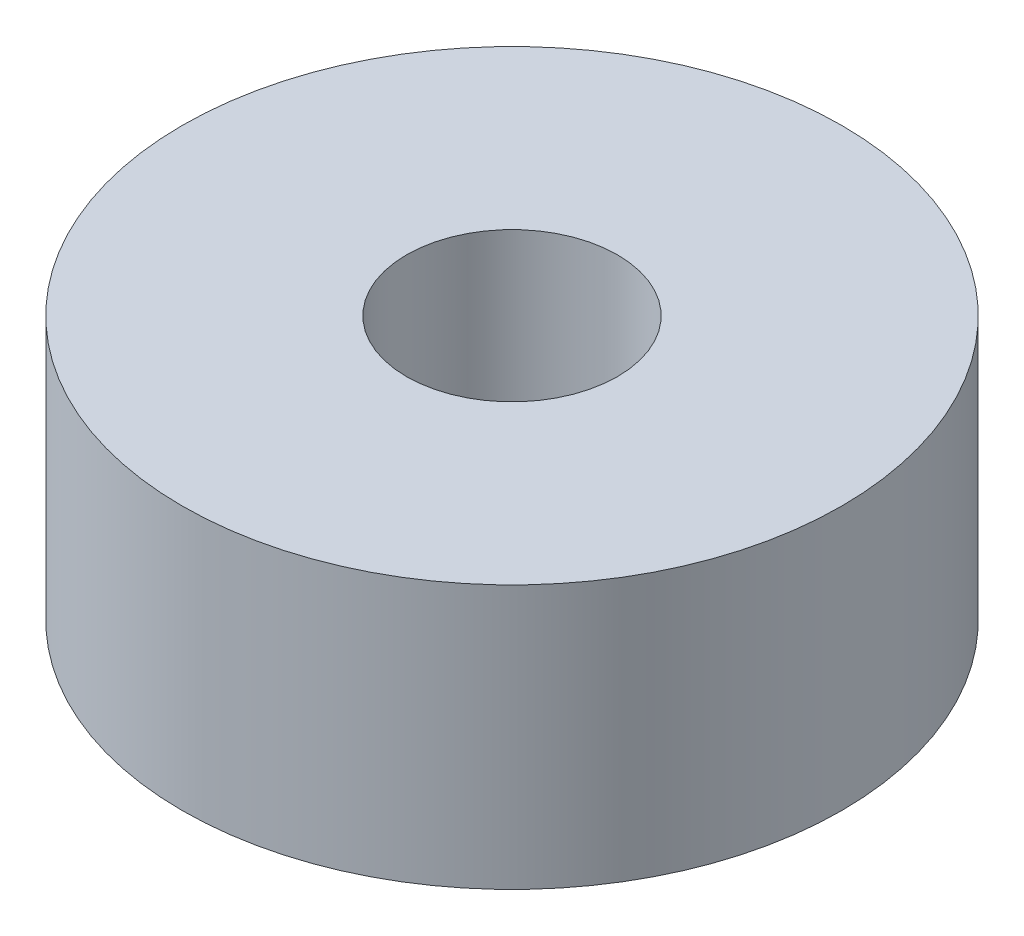
ISO-10303-21;
HEADER;
FILE_DESCRIPTION(('STEP AP214'),'2;1');
FILE_NAME('part.step','',(''),(''),'','','');
FILE_SCHEMA(('AUTOMOTIVE_DESIGN { 1 0 10303 214 1 1 1 1 }'));
ENDSEC;
DATA;
#1=APPLICATION_CONTEXT('core data for automotive mechanical design processes');
#2=APPLICATION_PROTOCOL_DEFINITION('international standard','automotive_design',2000,#1);
#3=PRODUCT_CONTEXT('',#1,'mechanical');
#4=PRODUCT('Part','Part','',(#3));
#5=PRODUCT_RELATED_PRODUCT_CATEGORY('part','',(#4));
#6=PRODUCT_DEFINITION_FORMATION('','',#4);
#7=PRODUCT_DEFINITION_CONTEXT('part definition',#1,'design');
#8=PRODUCT_DEFINITION('design','',#6,#7);
#9=PRODUCT_DEFINITION_SHAPE('','',#8);
#10=(LENGTH_UNIT() NAMED_UNIT(*) SI_UNIT(.MILLI.,.METRE.));
#11=(NAMED_UNIT(*) PLANE_ANGLE_UNIT() SI_UNIT($,.RADIAN.));
#12=(NAMED_UNIT(*) SI_UNIT($,.STERADIAN.) SOLID_ANGLE_UNIT());
#13=UNCERTAINTY_MEASURE_WITH_UNIT(LENGTH_MEASURE(1.E-05),#10,'distance_accuracy_value','');
#14=(GEOMETRIC_REPRESENTATION_CONTEXT(3) GLOBAL_UNCERTAINTY_ASSIGNED_CONTEXT((#13)) GLOBAL_UNIT_ASSIGNED_CONTEXT((#10,
#11,#12)) REPRESENTATION_CONTEXT('',''));
#15=CARTESIAN_POINT('',(0.,0.,0.));
#16=DIRECTION('',(0.,0.,1.));
#17=DIRECTION('',(1.,0.,0.));
#18=AXIS2_PLACEMENT_3D('',#15,#16,#17);
#19=CARTESIAN_POINT('',(0.,4.,0.));
#20=DIRECTION('',(0.,1.,0.));
#21=DIRECTION('',(0.,0.,1.));
#22=AXIS2_PLACEMENT_3D('',#19,#20,#21);
#23=PLANE('',#22);
#24=CARTESIAN_POINT('',(0.,4.,0.));
#25=DIRECTION('',(0.,1.,0.));
#26=DIRECTION('',(0.,0.,1.));
#27=AXIS2_PLACEMENT_3D('',#24,#25,#26);
#28=CIRCLE('',#27,5.);
#29=CARTESIAN_POINT('',(0.,4.,5.));
#30=VERTEX_POINT('',#29);
#31=EDGE_CURVE('E10',#30,#30,#28,.T.);
#32=ORIENTED_EDGE('',*,*,#31,.T.);
#33=EDGE_LOOP('',(#32));
#34=FACE_BOUND('',#33,.T.);
#35=CARTESIAN_POINT('',(0.,4.,0.));
#36=DIRECTION('',(0.,1.,0.));
#37=DIRECTION('',(0.,0.,1.));
#38=AXIS2_PLACEMENT_3D('',#35,#36,#37);
#39=CIRCLE('',#38,1.6);
#40=CARTESIAN_POINT('',(0.,4.,1.6));
#41=VERTEX_POINT('',#40);
#42=EDGE_CURVE('E42',#41,#41,#39,.T.);
#43=ORIENTED_EDGE('',*,*,#42,.F.);
#44=EDGE_LOOP('',(#43));
#45=FACE_BOUND('',#44,.T.);
#46=ADVANCED_FACE('F31',(#34,#45),#23,.T.);
#47=CARTESIAN_POINT('',(0.,0.,0.));
#48=DIRECTION('',(0.,1.,0.));
#49=DIRECTION('',(0.,0.,1.));
#50=AXIS2_PLACEMENT_3D('',#47,#48,#49);
#51=PLANE('',#50);
#52=CARTESIAN_POINT('',(0.,0.,0.));
#53=DIRECTION('',(0.,1.,0.));
#54=DIRECTION('',(0.,0.,1.));
#55=AXIS2_PLACEMENT_3D('',#52,#53,#54);
#56=CIRCLE('',#55,5.);
#57=CARTESIAN_POINT('',(0.,0.,5.));
#58=VERTEX_POINT('',#57);
#59=EDGE_CURVE('E35',#58,#58,#56,.T.);
#60=ORIENTED_EDGE('',*,*,#59,.F.);
#61=EDGE_LOOP('',(#60));
#62=FACE_BOUND('',#61,.T.);
#63=CARTESIAN_POINT('',(0.,0.,0.));
#64=DIRECTION('',(0.,1.,0.));
#65=DIRECTION('',(0.,0.,1.));
#66=AXIS2_PLACEMENT_3D('',#63,#64,#65);
#67=CIRCLE('',#66,1.6);
#68=CARTESIAN_POINT('',(0.,0.,1.6));
#69=VERTEX_POINT('',#68);
#70=EDGE_CURVE('E44',#69,#69,#67,.T.);
#71=ORIENTED_EDGE('',*,*,#70,.T.);
#72=EDGE_LOOP('',(#71));
#73=FACE_BOUND('',#72,.T.);
#74=ADVANCED_FACE('F54',(#62,#73),#51,.F.);
#75=CARTESIAN_POINT('',(0.,4.,0.));
#76=DIRECTION('',(0.,-1.,0.));
#77=DIRECTION('',(0.,0.,-1.));
#78=AXIS2_PLACEMENT_3D('',#75,#76,#77);
#79=CYLINDRICAL_SURFACE('',#78,5.);
#80=ORIENTED_EDGE('',*,*,#31,.F.);
#81=EDGE_LOOP('',(#80));
#82=FACE_BOUND('',#81,.T.);
#83=ORIENTED_EDGE('',*,*,#59,.T.);
#84=EDGE_LOOP('',(#83));
#85=FACE_BOUND('',#84,.T.);
#86=ADVANCED_FACE('F33',(#82,#85),#79,.T.);
#87=CARTESIAN_POINT('',(0.,4.,0.));
#88=DIRECTION('',(0.,-1.,0.));
#89=DIRECTION('',(0.,0.,-1.));
#90=AXIS2_PLACEMENT_3D('',#87,#88,#89);
#91=CYLINDRICAL_SURFACE('',#90,1.6);
#92=ORIENTED_EDGE('',*,*,#42,.T.);
#93=EDGE_LOOP('',(#92));
#94=FACE_BOUND('',#93,.T.);
#95=ORIENTED_EDGE('',*,*,#70,.F.);
#96=EDGE_LOOP('',(#95));
#97=FACE_BOUND('',#96,.T.);
#98=ADVANCED_FACE('F50',(#94,#97),#91,.F.);
#99=CLOSED_SHELL('',(#46,#74,#86,#98));
#100=MANIFOLD_SOLID_BREP('B2',#99);
#101=ADVANCED_BREP_SHAPE_REPRESENTATION('',(#18,#100),#14);
#102=SHAPE_DEFINITION_REPRESENTATION(#9,#101);
ENDSEC;
END-ISO-10303-21;
